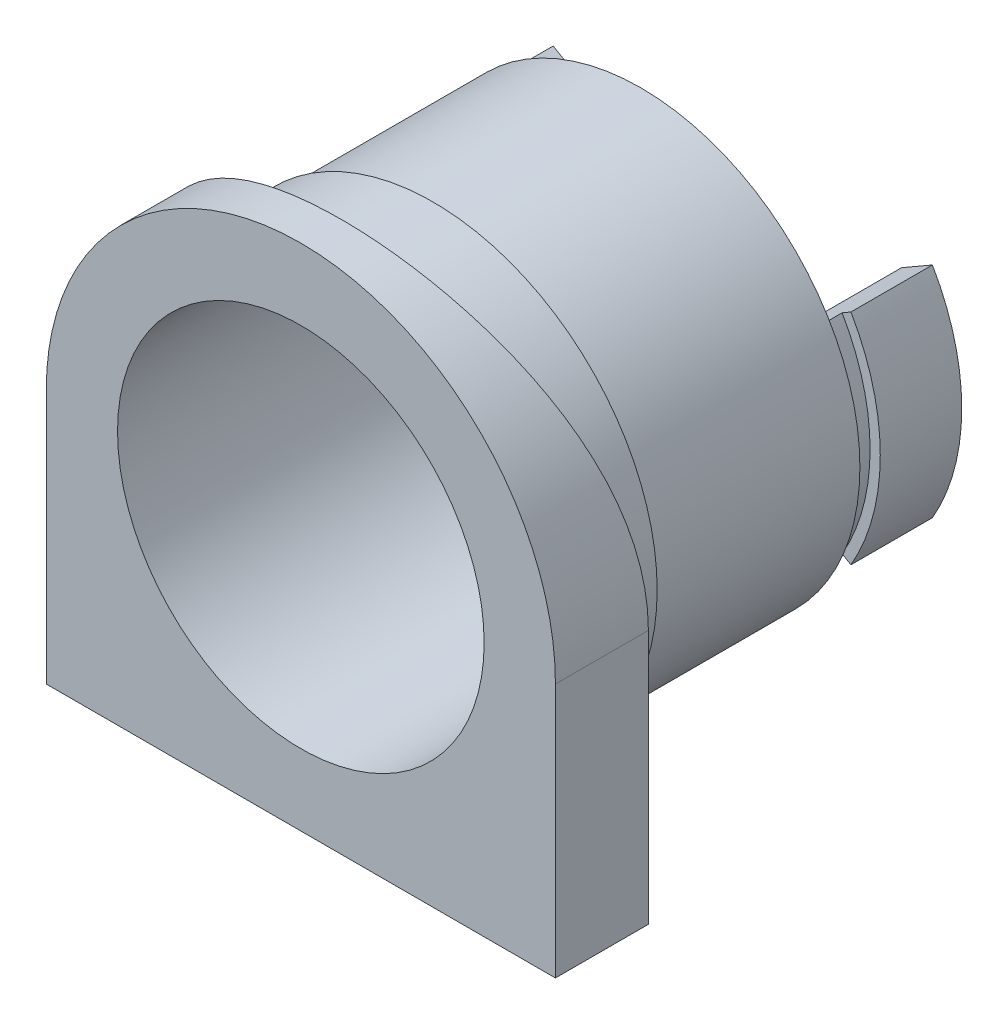
ISO-10303-21;
HEADER;
FILE_DESCRIPTION(('STEP AP214'),'2;1');
FILE_NAME('part.step','',(''),(''),'','','');
FILE_SCHEMA(('AUTOMOTIVE_DESIGN { 1 0 10303 214 1 1 1 1 }'));
ENDSEC;
DATA;
#1=APPLICATION_CONTEXT('core data for automotive mechanical design processes');
#2=APPLICATION_PROTOCOL_DEFINITION('international standard','automotive_design',2000,#1);
#3=PRODUCT_CONTEXT('',#1,'mechanical');
#4=PRODUCT('Part','Part','',(#3));
#5=PRODUCT_RELATED_PRODUCT_CATEGORY('part','',(#4));
#6=PRODUCT_DEFINITION_FORMATION('','',#4);
#7=PRODUCT_DEFINITION_CONTEXT('part definition',#1,'design');
#8=PRODUCT_DEFINITION('design','',#6,#7);
#9=PRODUCT_DEFINITION_SHAPE('','',#8);
#10=(LENGTH_UNIT() NAMED_UNIT(*) SI_UNIT(.MILLI.,.METRE.));
#11=(NAMED_UNIT(*) PLANE_ANGLE_UNIT() SI_UNIT($,.RADIAN.));
#12=(NAMED_UNIT(*) SI_UNIT($,.STERADIAN.) SOLID_ANGLE_UNIT());
#13=UNCERTAINTY_MEASURE_WITH_UNIT(LENGTH_MEASURE(1.E-05),#10,'distance_accuracy_value','');
#14=(GEOMETRIC_REPRESENTATION_CONTEXT(3) GLOBAL_UNCERTAINTY_ASSIGNED_CONTEXT((#13)) GLOBAL_UNIT_ASSIGNED_CONTEXT((#10,
#11,#12)) REPRESENTATION_CONTEXT('',''));
#15=CARTESIAN_POINT('',(0.,0.,0.));
#16=DIRECTION('',(0.,0.,1.));
#17=DIRECTION('',(1.,0.,0.));
#18=AXIS2_PLACEMENT_3D('',#15,#16,#17);
#19=CARTESIAN_POINT('',(0.,25.,0.));
#20=DIRECTION('',(0.,-1.,0.));
#21=DIRECTION('',(0.,0.,-1.));
#22=AXIS2_PLACEMENT_3D('',#19,#20,#21);
#23=CYLINDRICAL_SURFACE('',#22,31.75);
#24=CARTESIAN_POINT('',(11.,12.5,29.7835944774972));
#25=CARTESIAN_POINT('',(11.0000004837366,12.7988045156591,29.7835940735881));
#26=CARTESIAN_POINT('',(10.9878148665602,13.0976019451086,29.7881032642781));
#27=CARTESIAN_POINT('',(10.9391994137707,13.6929411988618,29.8059907783039));
#28=CARTESIAN_POINT('',(10.9027703101694,13.9894830909961,29.8193688338518));
#29=CARTESIAN_POINT('',(10.8060294680746,14.5781508853745,29.8545619247872));
#30=CARTESIAN_POINT('',(10.7457160089366,14.8702764678903,29.8763775680214));
#31=CARTESIAN_POINT('',(10.6017814684766,15.4480269694851,29.9277556625212));
#32=CARTESIAN_POINT('',(10.5181600402937,15.7336517917537,29.9573182290734));
#33=CARTESIAN_POINT('',(10.3285779253418,16.2958230567793,30.0232079131872));
#34=CARTESIAN_POINT('',(10.2226697696831,16.5723891106207,30.0595191007549));
#35=CARTESIAN_POINT('',(9.98922145843859,17.1155020603258,30.137901549864));
#36=CARTESIAN_POINT('',(9.86167326548889,17.3820451884582,30.1799749504355));
#37=CARTESIAN_POINT('',(9.58592887044172,17.9034188829195,30.2686873279618));
#38=CARTESIAN_POINT('',(9.43773299701141,18.1582496355986,30.3153262322398));
#39=CARTESIAN_POINT('',(9.12169709697834,18.654775150094,30.4119127515399));
#40=CARTESIAN_POINT('',(8.95385581382453,18.8964690702086,30.461860578117));
#41=CARTESIAN_POINT('',(8.59277739423418,19.3743933857487,30.5657209928924));
#42=CARTESIAN_POINT('',(8.39881221016691,19.6100569381223,30.619712180324));
#43=CARTESIAN_POINT('',(7.99206848311208,20.0643776369776,30.7283850199948));
#44=CARTESIAN_POINT('',(7.77928955476814,20.2830344349424,30.7830666863572));
#45=CARTESIAN_POINT('',(7.33616201424532,20.7020562394086,30.8916698259496));
#46=CARTESIAN_POINT('',(7.10581008534665,20.9024177771158,30.9455911533869));
#47=CARTESIAN_POINT('',(6.62894704943582,21.283519684909,31.0512349464493));
#48=CARTESIAN_POINT('',(6.38243643121762,21.4642606480709,31.1029574785092));
#49=CARTESIAN_POINT('',(5.86741138620455,21.8098003468942,31.2042755104669));
#50=CARTESIAN_POINT('',(5.59846805973601,21.9739911930013,31.2537670759096));
#51=CARTESIAN_POINT('',(5.0468924444883,22.2789644178502,31.3475611828407));
#52=CARTESIAN_POINT('',(4.76426564402314,22.4197560829766,31.3918657807969));
#53=CARTESIAN_POINT('',(4.1871617275064,22.6768094948052,31.4740387153889));
#54=CARTESIAN_POINT('',(3.89268479427916,22.7930716197775,31.5119071512751));
#55=CARTESIAN_POINT('',(3.29401948129225,22.9999868771507,31.5800993286113));
#56=CARTESIAN_POINT('',(2.98983155442748,23.0906412018949,31.6104234213311));
#57=CARTESIAN_POINT('',(2.38557781894691,23.242551580364,31.661648669663));
#58=CARTESIAN_POINT('',(2.08578234279074,23.3047791272631,31.6828594478546));
#59=CARTESIAN_POINT('',(1.48157824898808,23.4040655773414,31.716856154102));
#60=CARTESIAN_POINT('',(1.17716973616099,23.4411250515264,31.7296422732937));
#61=CARTESIAN_POINT('',(0.566152329793252,23.4896940891277,31.7464227291337));
#62=CARTESIAN_POINT('',(0.259543978805665,23.5012097489534,31.7504191635684));
#63=CARTESIAN_POINT('',(-0.353546032734361,23.4985894231794,31.7495112585533));
#64=CARTESIAN_POINT('',(-0.660027696289746,23.4844540851594,31.7446071438049));
#65=CARTESIAN_POINT('',(-1.25752160589826,23.431822341013,31.7264348376607));
#66=CARTESIAN_POINT('',(-1.54863886729345,23.3943840312893,31.7135300223054));
#67=CARTESIAN_POINT('',(-2.12651247105397,23.2964726286139,31.6800285040974));
#68=CARTESIAN_POINT('',(-2.41326895869279,23.2360003047661,31.659432058068));
#69=CARTESIAN_POINT('',(-2.98048490588686,23.0925584663377,31.6110778125335));
#70=CARTESIAN_POINT('',(-3.26094413271922,23.0095881217923,31.5833197488341));
#71=CARTESIAN_POINT('',(-3.8137342691918,22.8218526711485,31.5213466832944));
#72=CARTESIAN_POINT('',(-4.08606498828875,22.7170870545973,31.4871315302286));
#73=CARTESIAN_POINT('',(-4.6245009768124,22.4850429299172,31.4125986271563));
#74=CARTESIAN_POINT('',(-4.89047352364684,22.357480975659,31.3722050920551));
#75=CARTESIAN_POINT('',(-5.41082449761259,22.0817386355539,31.286659078122));
#76=CARTESIAN_POINT('',(-5.66519860816954,21.9335506551685,31.2415048478858));
#77=CARTESIAN_POINT('',(-6.16074844158412,21.617648130369,31.1475725326789));
#78=CARTESIAN_POINT('',(-6.40192623678451,21.4499366649255,31.0987950195595));
#79=CARTESIAN_POINT('',(-6.86989292902817,21.0959692978268,30.99877994157));
#80=CARTESIAN_POINT('',(-7.09667512541143,20.9097048625371,30.9475412503175));
#81=CARTESIAN_POINT('',(-7.5455872099519,20.5099289214534,30.8412464360083));
#82=CARTESIAN_POINT('',(-7.76689976872512,20.2955152295041,30.7861284038444));
#83=CARTESIAN_POINT('',(-8.19069906421345,19.8489570128521,30.676096087994));
#84=CARTESIAN_POINT('',(-8.39319351321859,19.6168198235177,30.6211817297733));
#85=CARTESIAN_POINT('',(-8.77829891209785,19.1359925404337,30.5130136760306));
#86=CARTESIAN_POINT('',(-8.96089773733547,18.8872925001676,30.4597610071116));
#87=CARTESIAN_POINT('',(-9.30476696647265,18.3750683224439,30.3564826530195));
#88=CARTESIAN_POINT('',(-9.46604582819075,18.111550122976,30.3064556922384));
#89=CARTESIAN_POINT('',(-9.76869617000565,17.5666860069034,30.2102751159569));
#90=CARTESIAN_POINT('',(-9.9096886211705,17.2851152915449,30.1642004873604));
#91=CARTESIAN_POINT('',(-10.1673150822425,16.7101013424783,30.0783419747209));
#92=CARTESIAN_POINT('',(-10.2839486770642,16.4166579065555,30.0385581978794));
#93=CARTESIAN_POINT('',(-10.4917444879667,15.8200936803377,29.9666130251357));
#94=CARTESIAN_POINT('',(-10.5829163086007,15.5169765872955,29.9344487557407));
#95=CARTESIAN_POINT('',(-10.7389279857446,14.9032591907387,29.8788353531875));
#96=CARTESIAN_POINT('',(-10.8037693329844,14.5926593119256,29.8553857266464));
#97=CARTESIAN_POINT('',(-10.903947945824,13.9815880860122,29.8189388863301));
#98=CARTESIAN_POINT('',(-10.9405587434141,13.6813519146249,29.8054916135803));
#99=CARTESIAN_POINT('',(-10.9889306905587,13.0786177345116,29.7876916641315));
#100=CARTESIAN_POINT('',(-11.0006926398669,12.7761197988944,29.7833386947348));
#101=CARTESIAN_POINT('',(-10.9992444023933,12.171248098606,29.783873512462));
#102=CARTESIAN_POINT('',(-10.9860386768088,11.8688743214059,29.7887596487524));
#103=CARTESIAN_POINT('',(-10.9348023974479,11.2665274384167,29.8076053965112));
#104=CARTESIAN_POINT('',(-10.896772197263,10.9665542984952,29.8215648787419));
#105=CARTESIAN_POINT('',(-10.7982107678858,10.3827132232494,29.8573905388713));
#106=CARTESIAN_POINT('',(-10.7385998846091,10.0986692388235,29.8789324348259));
#107=CARTESIAN_POINT('',(-10.5972998528137,9.53668889005206,29.9293394212264));
#108=CARTESIAN_POINT('',(-10.5156029107073,9.25875471920583,29.9582070965259));
#109=CARTESIAN_POINT('',(-10.3308518662873,8.71093069089519,30.0224174687142));
#110=CARTESIAN_POINT('',(-10.2278027450337,8.44103897404423,30.0577586552326));
#111=CARTESIAN_POINT('',(-10.0010967218656,7.91074581268088,30.1339486337277));
#112=CARTESIAN_POINT('',(-9.87743184152771,7.65034809013553,30.1747995568326));
#113=CARTESIAN_POINT('',(-9.60597182563347,7.13216334449882,30.2623330907141));
#114=CARTESIAN_POINT('',(-9.45751233007802,6.87474944756413,30.3091641966178));
#115=CARTESIAN_POINT('',(-9.14053247616061,6.37311332517895,30.406259950664));
#116=CARTESIAN_POINT('',(-8.97200315707815,6.12889706345056,30.4565261281873));
#117=CARTESIAN_POINT('',(-8.6160052865213,5.65512930657603,30.5591436542022));
#118=CARTESIAN_POINT('',(-8.42853564017039,5.42557866045321,30.6114951231313));
#119=CARTESIAN_POINT('',(-8.03578650692215,4.98243394107842,30.716933001531));
#120=CARTESIAN_POINT('',(-7.8305065582212,4.76884028184282,30.7700194300284));
#121=CARTESIAN_POINT('',(-7.39199653835267,4.34797225256389,30.8783830906163));
#122=CARTESIAN_POINT('',(-7.15786228481252,4.14163025934582,30.9336276155229));
#123=CARTESIAN_POINT('',(-6.67268825167441,3.74942845637222,31.0418987789709));
#124=CARTESIAN_POINT('',(-6.42165455539928,3.56356133908655,31.0949262045805));
#125=CARTESIAN_POINT('',(-5.90406191349527,3.2134665229006,31.1973422847447));
#126=CARTESIAN_POINT('',(-5.63749672868136,3.04924760797746,31.2467294586691));
#127=CARTESIAN_POINT('',(-5.09076351663816,2.74386737308592,31.34044520305));
#128=CARTESIAN_POINT('',(-4.81060131491679,2.60269628967937,31.3847759130964));
#129=CARTESIAN_POINT('',(-4.24007560534808,2.3452402135934,31.4669165866103));
#130=CARTESIAN_POINT('',(-3.94977866582297,2.22881914287727,31.5047619715036));
#131=CARTESIAN_POINT('',(-3.3595433494416,2.02090828837879,31.5731566028863));
#132=CARTESIAN_POINT('',(-3.05960495167445,1.92941855867292,31.6037058335503));
#133=CARTESIAN_POINT('',(-2.45242342376734,1.77228237286387,31.6566098731674));
#134=CARTESIAN_POINT('',(-2.14518270393462,1.70662751158658,31.6789673470817));
#135=CARTESIAN_POINT('',(-1.52571084121241,1.60179484681747,31.7148378753717));
#136=CARTESIAN_POINT('',(-1.21347993508479,1.56261579096285,31.7283513480867));
#137=CARTESIAN_POINT('',(-0.602401856905683,1.5124480698062,31.7456813119193));
#138=CARTESIAN_POINT('',(-0.303675580342155,1.50013502939873,31.7499532705671));
#139=CARTESIAN_POINT('',(0.293783051350596,1.49986719472863,31.750045958871));
#140=CARTESIAN_POINT('',(0.592515405878516,1.51191152772046,31.7458669913312));
#141=CARTESIAN_POINT('',(1.18774669222857,1.56023707587323,31.7291727240599));
#142=CARTESIAN_POINT('',(1.48424582395398,1.59651609499283,31.7166581796623));
#143=CARTESIAN_POINT('',(2.07287834248368,1.69295955241364,31.6836325741242));
#144=CARTESIAN_POINT('',(2.36501172166856,1.75312403239645,31.6631214990292));
#145=CARTESIAN_POINT('',(2.93748243189968,1.89544543071902,31.6151021177395));
#146=CARTESIAN_POINT('',(3.21793805328537,1.97717375044415,31.5877306476403));
#147=CARTESIAN_POINT('',(3.77092728442394,2.16243887770285,31.5264972356726));
#148=CARTESIAN_POINT('',(4.04345804012606,2.26598343406927,31.4926329880429));
#149=CARTESIAN_POINT('',(4.57878537623986,2.49403340208929,31.4192650798679));
#150=CARTESIAN_POINT('',(4.84158263790939,2.61853734337758,31.3797618149467));
#151=CARTESIAN_POINT('',(5.35593463997862,2.88760102357413,31.296075964627));
#152=CARTESIAN_POINT('',(5.60748861982956,3.03216211653649,31.2518930633549));
#153=CARTESIAN_POINT('',(6.10742479622201,3.34631997852364,31.1581293445595));
#154=CARTESIAN_POINT('',(6.35530763129633,3.51666903706662,31.1084058118882));
#155=CARTESIAN_POINT('',(6.83596201213684,3.87678657754793,31.0063300017317));
#156=CARTESIAN_POINT('',(7.06873324325283,4.06655546362945,30.9539776695505));
#157=CARTESIAN_POINT('',(7.51789921128115,4.4643779676208,30.8479652905804));
#158=CARTESIAN_POINT('',(7.73428883458543,4.67243725153332,30.7943048423098));
#159=CARTESIAN_POINT('',(8.14935605083224,5.10554497308927,30.6870730306563));
#160=CARTESIAN_POINT('',(8.34803374156719,5.33059331691879,30.6335016667832));
#161=CARTESIAN_POINT('',(8.73473182618425,5.80653214624265,30.5255466770557));
#162=CARTESIAN_POINT('',(8.92191229866699,6.05812100254567,30.4712291407153));
#163=CARTESIAN_POINT('',(9.27432587943315,6.57672973917898,30.3658230246146));
#164=CARTESIAN_POINT('',(9.43956711174731,6.84374385472665,30.3147332533171));
#165=CARTESIAN_POINT('',(9.74695566252108,7.39162220661684,30.217302429698));
#166=CARTESIAN_POINT('',(9.88910078781604,7.67248775496933,30.1709618285031));
#167=CARTESIAN_POINT('',(10.1490944084618,8.24617240574861,30.0845004407149));
#168=CARTESIAN_POINT('',(10.2669437142924,8.53899110904179,30.044379446654));
#169=CARTESIAN_POINT('',(10.475332313564,9.12902285573466,29.9723514621763));
#170=CARTESIAN_POINT('',(10.5663353973888,9.4260551229444,29.9403065698715));
#171=CARTESIAN_POINT('',(10.7230263924875,10.0274978539613,29.8845467486642));
#172=CARTESIAN_POINT('',(10.7887145970947,10.3319082322319,29.8608317232405));
#173=CARTESIAN_POINT('',(10.89407797322,10.9456589118803,29.822553790206));
#174=CARTESIAN_POINT('',(10.9337625073368,11.254997397761,29.8079875886477));
#175=CARTESIAN_POINT('',(10.9867227995942,11.876226556448,29.7885083144017));
#176=CARTESIAN_POINT('',(10.9999994950908,12.188117138272,29.7835948990849));
#177=CARTESIAN_POINT('',(11.,12.5,29.7835944774972));
#178=B_SPLINE_CURVE_WITH_KNOTS('',3,(#24,#25,#26,#27,#28,#29,#30,#31,#32,#33,#34,#35,#36,#37,
#38,#39,#40,#41,#42,#43,#44,#45,#46,#47,#48,#49,#50,#51,#52,#53,#54,#55,#56,#57,#58,#59,#60,#61,
#62,#63,#64,#65,#66,#67,#68,#69,#70,#71,#72,#73,#74,#75,#76,#77,#78,#79,#80,#81,#82,#83,#84,#85,
#86,#87,#88,#89,#90,#91,#92,#93,#94,#95,#96,#97,#98,#99,#100,#101,#102,#103,#104,#105,#106,#107,
#108,#109,#110,#111,#112,#113,#114,#115,#116,#117,#118,#119,#120,#121,#122,#123,#124,#125,#126,
#127,#128,#129,#130,#131,#132,#133,#134,#135,#136,#137,#138,#139,#140,#141,#142,#143,#144,#145,
#146,#147,#148,#149,#150,#151,#152,#153,#154,#155,#156,#157,#158,#159,#160,#161,#162,#163,#164,
#165,#166,#167,#168,#169,#170,#171,#172,#173,#174,#175,#176,#177),.UNSPECIFIED.,.T.,.F.,(4,2,2,
2,2,2,2,2,2,2,2,2,2,2,2,2,2,2,2,2,2,2,2,2,2,2,2,2,2,2,2,2,2,2,2,2,2,2,2,2,2,2,2,2,2,2,2,2,2,2,2,
2,2,2,2,2,2,2,2,2,2,2,2,2,2,2,2,2,2,2,2,2,2,2,2,2,4),(0.,0.89612050760437,1.7922139588274,
2.68837197695511,3.58454333209999,4.47862555660303,5.37304058361594,6.26744137507036,
7.1618994050876,8.09072887239581,9.0195773690543,9.94860161194232,10.8775977651719,
11.8333080893072,12.7886382122211,13.7439536019085,14.6992245031288,15.6188188828204,
16.5383923983323,17.4577464203895,18.3770772329545,19.2574365057819,20.1377663860588,
21.0181287466202,21.8985117278893,22.790717986032,23.6832536293965,24.5756487047405,
25.4684561588987,26.4064810083158,27.3441197126063,28.2823266666072,29.2201603014377,
30.173714931476,31.1272858091693,32.0804964986421,33.0336532134733,33.940782606189,
34.8478828027373,35.7548209349166,36.6617461492552,37.5338372804966,38.4062365522932,
39.2784325384935,40.1509668567785,41.0524443208023,41.9543257937677,42.8562594313253,
43.7582164621281,44.7078983658289,45.6572402201688,46.6069661016209,47.5562886138642,
48.5002483441756,49.4442101219345,50.3878645346253,51.3314743072981,52.2274054328297,
53.1233044569512,54.019122309629,54.9149417255712,55.7941460530752,56.6736631901268,
57.5531186520391,58.4326335147197,59.3461803028218,60.2597461064806,61.1735959187592,
62.0874406851106,63.0410501622234,63.9943055300396,64.9476513644316,65.9009653911888,
66.8366892440448,67.7724022539836,68.7077781758885,69.6431208956873),.UNSPECIFIED.);
#179=CARTESIAN_POINT('',(11.,12.5,29.7835944774972));
#180=VERTEX_POINT('',#179);
#181=EDGE_CURVE('E284',#180,#180,#178,.T.);
#182=ORIENTED_EDGE('',*,*,#181,.T.);
#183=EDGE_LOOP('',(#182));
#184=FACE_BOUND('',#183,.T.);
#185=CARTESIAN_POINT('',(12.5,12.5,29.1858270398493));
#186=CARTESIAN_POINT('',(12.500000681174,12.6683947598953,29.185824502863));
#187=CARTESIAN_POINT('',(12.4965965258948,12.8367672094388,29.1872849933505));
#188=CARTESIAN_POINT('',(12.4829952330995,13.1731810831606,29.193105511989));
#189=CARTESIAN_POINT('',(12.4727983500225,13.3412225195015,29.1974654315343));
#190=CARTESIAN_POINT('',(12.4320593241305,13.8442413166206,29.2148478721032));
#191=CARTESIAN_POINT('',(12.3913687615542,14.1783129470855,29.2321731366469));
#192=CARTESIAN_POINT('',(12.2835746670639,14.8400409497707,29.27763088871));
#193=CARTESIAN_POINT('',(12.2165728803687,15.1677169900418,29.3057217358835));
#194=CARTESIAN_POINT('',(12.0568345026548,15.815734690863,29.3718011680507));
#195=CARTESIAN_POINT('',(11.9640964094384,16.1360759221071,29.4097903307896));
#196=CARTESIAN_POINT('',(11.753897655103,16.7668828716148,29.4944264759805));
#197=CARTESIAN_POINT('',(11.636468705882,17.0773606748711,29.5410623439725));
#198=CARTESIAN_POINT('',(11.3777663448393,17.6871149920698,29.6416630498035));
#199=CARTESIAN_POINT('',(11.2364838499793,17.9863871858636,29.6956306779213));
#200=CARTESIAN_POINT('',(10.9311108928296,18.5720618166748,29.8093921631098));
#201=CARTESIAN_POINT('',(10.7670104368175,18.8584585414151,29.8691885695968));
#202=CARTESIAN_POINT('',(10.4170818489378,19.4168657129839,29.9930218308649));
#203=CARTESIAN_POINT('',(10.2312436803657,19.6888694294435,30.0570606384766));
#204=CARTESIAN_POINT('',(9.82927634147381,20.2301051693252,30.1909736914685));
#205=CARTESIAN_POINT('',(9.61210094260061,20.4985280631909,30.2609797853123));
#206=CARTESIAN_POINT('',(9.15654039077104,21.0162562985031,30.4019257049153));
#207=CARTESIAN_POINT('',(8.91816370250819,21.2655691963233,30.4728651484778));
#208=CARTESIAN_POINT('',(8.42133978787304,21.7439177131666,30.6138897065208));
#209=CARTESIAN_POINT('',(8.16288065312289,21.9729411261228,30.6839742851506));
#210=CARTESIAN_POINT('',(7.62756254155442,22.409058351005,30.8214068105949));
#211=CARTESIAN_POINT('',(7.35071045757977,22.6161603034863,30.8887557675188));
#212=CARTESIAN_POINT('',(6.76910993131326,23.0146624476908,31.0215082959345));
#213=CARTESIAN_POINT('',(6.46369862924298,23.2051549043164,31.0867379889302));
#214=CARTESIAN_POINT('',(5.83653477964978,23.5595931550246,31.2105673948998));
#215=CARTESIAN_POINT('',(5.51478169488399,23.7235380756027,31.2691668896985));
#216=CARTESIAN_POINT('',(4.85721182554007,24.023368317228,31.3780337713502));
#217=CARTESIAN_POINT('',(4.52139956757596,24.1592625873991,31.4283038145726));
#218=CARTESIAN_POINT('',(3.83806264508903,24.401709198964,31.5190503118722));
#219=CARTESIAN_POINT('',(3.49053870523041,24.5082633520595,31.5595273706308));
#220=CARTESIAN_POINT('',(2.80306066538316,24.6865893876332,31.6278201190493));
#221=CARTESIAN_POINT('',(2.46351994946712,24.7597621236818,31.6561420031095));
#222=CARTESIAN_POINT('',(1.77881204952188,24.8776610210229,31.7019878557479));
#223=CARTESIAN_POINT('',(1.43364502691406,24.9223879969694,31.7195121335568));
#224=CARTESIAN_POINT('',(0.740495480617894,24.9828948375113,31.743257370208));
#225=CARTESIAN_POINT('',(0.392513800178303,24.9986830711867,31.7494815970186));
#226=CARTESIAN_POINT('',(-0.303563621320748,25.0011586856411,31.7504561026889));
#227=CARTESIAN_POINT('',(-0.651659358119436,24.9878470516973,31.745206770026));
#228=CARTESIAN_POINT('',(-1.32624209333998,24.9337954189748,31.7239846499863));
#229=CARTESIAN_POINT('',(-1.65287240360701,24.8945905701779,31.7086121820229));
#230=CARTESIAN_POINT('',(-2.30142776243951,24.7906987778796,31.6681462566775));
#231=CARTESIAN_POINT('',(-2.62335301377195,24.726012935873,31.643053219498));
#232=CARTESIAN_POINT('',(-3.26033049990505,24.5717702617362,31.5837786507549));
#233=CARTESIAN_POINT('',(-3.57538259826194,24.4822129363484,31.549596938943));
#234=CARTESIAN_POINT('',(-4.19659231747662,24.2790245295243,31.4729895353529));
#235=CARTESIAN_POINT('',(-4.50274969215006,24.165392782487,31.4305636156443));
#236=CARTESIAN_POINT('',(-5.108754740744,23.9131471562472,31.3378122026961));
#237=CARTESIAN_POINT('',(-5.40844284581223,23.7741896643326,31.2873794676709));
#238=CARTESIAN_POINT('',(-5.99511877122897,23.4734794824877,31.1802824260667));
#239=CARTESIAN_POINT('',(-6.28210197362068,23.3117185919695,31.1236158792934));
#240=CARTESIAN_POINT('',(-6.84172153637751,22.9665627409067,31.0054051701929));
#241=CARTESIAN_POINT('',(-7.11435654821618,22.7831657521081,30.9438605507536));
#242=CARTESIAN_POINT('',(-7.64385017515167,22.3959158501754,30.8173354732486));
#243=CARTESIAN_POINT('',(-7.90070798517794,22.1920618945698,30.7523548401662));
#244=CARTESIAN_POINT('',(-8.41320005225029,21.7514552100128,30.61625825404));
#245=CARTESIAN_POINT('',(-8.66771064409511,21.5134332987741,30.5450153723116));
#246=CARTESIAN_POINT('',(-9.15595193592759,21.0170273978028,30.4022327381339));
#247=CARTESIAN_POINT('',(-9.38968186092641,20.758642649341,30.3306929747167));
#248=CARTESIAN_POINT('',(-9.83505210026969,20.222896830153,30.1892178326921));
#249=CARTESIAN_POINT('',(-10.0466839452729,19.9455285507035,30.1192830771758));
#250=CARTESIAN_POINT('',(-10.4464159243595,19.3734399084734,29.9829869110573));
#251=CARTESIAN_POINT('',(-10.6345133847999,19.0787175797552,29.9166259069411));
#252=CARTESIAN_POINT('',(-10.990629045473,18.4653370300038,29.7876724482339));
#253=CARTESIAN_POINT('',(-11.1579554568322,18.1462441285567,29.7252331708354));
#254=CARTESIAN_POINT('',(-11.4648363223169,17.493741404517,29.6082252832817));
#255=CARTESIAN_POINT('',(-11.6044025971037,17.1603377494925,29.5536533258457));
#256=CARTESIAN_POINT('',(-11.8543566877896,16.4818039453556,29.4542835367313));
#257=CARTESIAN_POINT('',(-11.9647802000077,16.136688732054,29.4094737594346));
#258=CARTESIAN_POINT('',(-12.1554371715181,15.437131615192,29.3311860426723));
#259=CARTESIAN_POINT('',(-12.2356841886682,15.0826939768288,29.2977030149445));
#260=CARTESIAN_POINT('',(-12.3666523666983,14.3586017015129,29.2426680256794));
#261=CARTESIAN_POINT('',(-12.4166222568309,13.9887858244769,29.2214202471009));
#262=CARTESIAN_POINT('',(-12.4666242090409,13.4317007934436,29.2001037833129));
#263=CARTESIAN_POINT('',(-12.4791326998786,13.2456642081305,29.1947575167451));
#264=CARTESIAN_POINT('',(-12.4958222923358,12.8730954335746,29.187616733677));
#265=CARTESIAN_POINT('',(-12.5000009553148,12.6865631152002,29.1858232572926));
#266=CARTESIAN_POINT('',(-12.5,12.5,29.1858270398493));
#267=B_SPLINE_CURVE_WITH_KNOTS('',3,(#185,#186,#187,#188,#189,#190,#191,#192,#193,#194,#195,
#196,#197,#198,#199,#200,#201,#202,#203,#204,#205,#206,#207,#208,#209,#210,#211,#212,#213,#214,
#215,#216,#217,#218,#219,#220,#221,#222,#223,#224,#225,#226,#227,#228,#229,#230,#231,#232,#233,
#234,#235,#236,#237,#238,#239,#240,#241,#242,#243,#244,#245,#246,#247,#248,#249,#250,#251,#252,
#253,#254,#255,#256,#257,#258,#259,#260,#261,#262,#263,#264,#265,#266),.UNSPECIFIED.,.F.,.F.,(4,
2,2,2,2,2,2,2,2,2,2,2,2,2,2,2,2,2,2,2,2,2,2,2,2,2,2,2,2,2,2,2,2,2,2,2,2,2,2,2,4),(0.,
0.505099275793884,1.01017963285954,2.01974308857927,3.02544042018686,4.03119646550707,
5.03566856540298,6.04052401798826,7.04582096769675,8.05158392755791,9.107316526637,
10.1626294966353,11.2185730872474,12.274123166236,13.370186436108,14.4662857628672,
15.5620348538358,16.6577162690016,17.7018358291127,18.7459254854858,19.7897131436059,
20.8334654612063,21.8203056214623,22.8071031271754,23.7939202047028,24.7807645689597,
25.7821579653133,26.7839124071398,27.7857608321523,28.7876603365509,29.8534833342511,
30.9193460638214,31.9856158095092,33.0520065798594,34.1476305320331,35.2427869484489,
36.3365956401854,37.4299123108523,38.5493515446696,39.1087607245319,39.6683336529952),.UNSPECIFIED.);
#268=CARTESIAN_POINT('',(12.5,12.5,29.1858270398493));
#269=VERTEX_POINT('',#268);
#270=CARTESIAN_POINT('',(-12.5,12.5,29.1858270398493));
#271=VERTEX_POINT('',#270);
#272=EDGE_CURVE('E157',#269,#271,#267,.T.);
#273=ORIENTED_EDGE('',*,*,#272,.F.);
#274=DIRECTION('',(0.,-1.,0.));
#275=VECTOR('',#274,1.);
#276=CARTESIAN_POINT('',(12.5,25.,29.1858270398493));
#277=LINE('',#276,#275);
#278=CARTESIAN_POINT('',(12.5,0.,29.1858270398493));
#279=VERTEX_POINT('',#278);
#280=EDGE_CURVE('E170',#269,#279,#277,.T.);
#281=ORIENTED_EDGE('',*,*,#280,.T.);
#282=CARTESIAN_POINT('',(0.,0.,0.));
#283=DIRECTION('',(0.,-1.,0.));
#284=DIRECTION('',(0.,0.,1.));
#285=AXIS2_PLACEMENT_3D('',#282,#283,#284);
#286=CIRCLE('',#285,31.75);
#287=CARTESIAN_POINT('',(-12.5,0.,29.1858270398493));
#288=VERTEX_POINT('',#287);
#289=EDGE_CURVE('E290',#279,#288,#286,.T.);
#290=ORIENTED_EDGE('',*,*,#289,.T.);
#291=DIRECTION('',(0.,-1.,0.));
#292=VECTOR('',#291,1.);
#293=CARTESIAN_POINT('',(-12.5,25.,29.1858270398493));
#294=LINE('',#293,#292);
#295=EDGE_CURVE('E166',#271,#288,#294,.T.);
#296=ORIENTED_EDGE('',*,*,#295,.F.);
#297=EDGE_LOOP('',(#273,#281,#290,#296));
#298=FACE_BOUND('',#297,.T.);
#299=ADVANCED_FACE('F32',(#184,#298),#23,.F.);
#300=CARTESIAN_POINT('',(-12.5,25.,29.1858270398493));
#301=DIRECTION('',(1.,0.,0.));
#302=DIRECTION('',(0.,0.,-1.));
#303=AXIS2_PLACEMENT_3D('',#300,#301,#302);
#304=PLANE('',#303);
#305=DIRECTION('',(0.,0.,1.));
#306=VECTOR('',#305,1.);
#307=CARTESIAN_POINT('',(-12.5,12.5,23.75));
#308=LINE('',#307,#306);
#309=CARTESIAN_POINT('',(-12.5,12.5,33.75));
#310=VERTEX_POINT('',#309);
#311=EDGE_CURVE('E152',#271,#310,#308,.T.);
#312=ORIENTED_EDGE('',*,*,#311,.F.);
#313=ORIENTED_EDGE('',*,*,#295,.T.);
#314=DIRECTION('',(0.,0.,1.));
#315=VECTOR('',#314,1.);
#316=CARTESIAN_POINT('',(-12.5,0.,29.1858270398493));
#317=LINE('',#316,#315);
#318=CARTESIAN_POINT('',(-12.5,0.,33.75));
#319=VERTEX_POINT('',#318);
#320=EDGE_CURVE('E164',#288,#319,#317,.T.);
#321=ORIENTED_EDGE('',*,*,#320,.T.);
#322=DIRECTION('',(0.,-1.,0.));
#323=VECTOR('',#322,1.);
#324=CARTESIAN_POINT('',(-12.5,25.,33.75));
#325=LINE('',#324,#323);
#326=EDGE_CURVE('E149',#310,#319,#325,.T.);
#327=ORIENTED_EDGE('',*,*,#326,.F.);
#328=EDGE_LOOP('',(#312,#313,#321,#327));
#329=FACE_BOUND('',#328,.T.);
#330=ADVANCED_FACE('F162',(#329),#304,.F.);
#331=CARTESIAN_POINT('',(-12.5,25.,33.75));
#332=DIRECTION('',(0.,0.,-1.));
#333=DIRECTION('',(-1.,0.,0.));
#334=AXIS2_PLACEMENT_3D('',#331,#332,#333);
#335=PLANE('',#334);
#336=CARTESIAN_POINT('',(0.,12.5,33.75));
#337=DIRECTION('',(0.,0.,1.));
#338=DIRECTION('',(1.,0.,0.));
#339=AXIS2_PLACEMENT_3D('',#336,#337,#338);
#340=CIRCLE('',#339,9.);
#341=CARTESIAN_POINT('',(9.,12.5,33.75));
#342=VERTEX_POINT('',#341);
#343=EDGE_CURVE('E286',#342,#342,#340,.T.);
#344=ORIENTED_EDGE('',*,*,#343,.F.);
#345=EDGE_LOOP('',(#344));
#346=FACE_BOUND('',#345,.T.);
#347=CARTESIAN_POINT('',(0.,12.5,33.75));
#348=DIRECTION('',(0.,0.,1.));
#349=DIRECTION('',(-1.,0.,0.));
#350=AXIS2_PLACEMENT_3D('',#347,#348,#349);
#351=CIRCLE('',#350,12.5);
#352=CARTESIAN_POINT('',(12.5,12.5,33.75));
#353=VERTEX_POINT('',#352);
#354=EDGE_CURVE('E49',#353,#310,#351,.T.);
#355=ORIENTED_EDGE('',*,*,#354,.T.);
#356=ORIENTED_EDGE('',*,*,#326,.T.);
#357=DIRECTION('',(1.,0.,0.));
#358=VECTOR('',#357,1.);
#359=CARTESIAN_POINT('',(-12.5,0.,33.75));
#360=LINE('',#359,#358);
#361=CARTESIAN_POINT('',(12.5,0.,33.75));
#362=VERTEX_POINT('',#361);
#363=EDGE_CURVE('E335',#319,#362,#360,.T.);
#364=ORIENTED_EDGE('',*,*,#363,.T.);
#365=DIRECTION('',(0.,-1.,0.));
#366=VECTOR('',#365,1.);
#367=CARTESIAN_POINT('',(12.5,25.,33.75));
#368=LINE('',#367,#366);
#369=EDGE_CURVE('E151',#353,#362,#368,.T.);
#370=ORIENTED_EDGE('',*,*,#369,.F.);
#371=EDGE_LOOP('',(#355,#356,#364,#370));
#372=FACE_BOUND('',#371,.T.);
#373=ADVANCED_FACE('F146',(#346,#372),#335,.F.);
#374=CARTESIAN_POINT('',(-7.79422863406001,8.00000000000011,12.05));
#375=DIRECTION('',(-0.499999999999988,0.866025403784446,0.));
#376=DIRECTION('',(-0.866025403784446,-0.499999999999988,0.));
#377=AXIS2_PLACEMENT_3D('',#374,#375,#376);
#378=PLANE('',#377);
#379=DIRECTION('',(0.866025403784446,0.499999999999988,0.));
#380=VECTOR('',#379,1.);
#381=CARTESIAN_POINT('',(-7.79422863406001,8.00000000000011,16.05));
#382=LINE('',#381,#380);
#383=CARTESIAN_POINT('',(-9.30977309068279,7.12500000000013,16.05));
#384=VERTEX_POINT('',#383);
#385=CARTESIAN_POINT('',(-8.87676038879057,7.37500000000012,16.05));
#386=VERTEX_POINT('',#385);
#387=EDGE_CURVE('E380',#384,#386,#382,.T.);
#388=ORIENTED_EDGE('',*,*,#387,.F.);
#389=DIRECTION('',(0.,0.,-1.));
#390=VECTOR('',#389,1.);
#391=CARTESIAN_POINT('',(-9.30977309068279,7.12500000000013,27.255));
#392=LINE('',#391,#390);
#393=CARTESIAN_POINT('',(-9.30977309068279,7.12500000000013,12.05));
#394=VERTEX_POINT('',#393);
#395=EDGE_CURVE('E198',#394,#384,#392,.F.);
#396=ORIENTED_EDGE('',*,*,#395,.F.);
#397=DIRECTION('',(-0.866025403784446,-0.499999999999988,0.));
#398=VECTOR('',#397,1.);
#399=CARTESIAN_POINT('',(-7.79422863406001,8.00000000000011,12.05));
#400=LINE('',#399,#398);
#401=CARTESIAN_POINT('',(-7.79422863406001,8.00000000000011,12.05));
#402=VERTEX_POINT('',#401);
#403=EDGE_CURVE('E238',#402,#394,#400,.T.);
#404=ORIENTED_EDGE('',*,*,#403,.F.);
#405=DIRECTION('',(0.,0.,1.));
#406=VECTOR('',#405,1.);
#407=CARTESIAN_POINT('',(-7.79422863406001,8.00000000000011,12.05));
#408=LINE('',#407,#406);
#409=CARTESIAN_POINT('',(-7.79422863406001,8.00000000000011,17.05));
#410=VERTEX_POINT('',#409);
#411=EDGE_CURVE('E184',#402,#410,#408,.T.);
#412=ORIENTED_EDGE('',*,*,#411,.T.);
#413=DIRECTION('',(-0.866025403784446,-0.499999999999988,0.));
#414=VECTOR('',#413,1.);
#415=CARTESIAN_POINT('',(-7.79422863406001,8.00000000000011,17.05));
#416=LINE('',#415,#414);
#417=CARTESIAN_POINT('',(-8.87676038879057,7.37500000000012,17.05));
#418=VERTEX_POINT('',#417);
#419=EDGE_CURVE('E234',#410,#418,#416,.T.);
#420=ORIENTED_EDGE('',*,*,#419,.T.);
#421=DIRECTION('',(0.,0.,-1.));
#422=VECTOR('',#421,1.);
#423=CARTESIAN_POINT('',(-8.87676038879057,7.37500000000012,12.049975));
#424=LINE('',#423,#422);
#425=EDGE_CURVE('E381',#386,#418,#424,.F.);
#426=ORIENTED_EDGE('',*,*,#425,.F.);
#427=EDGE_LOOP('',(#388,#396,#404,#412,#420,#426));
#428=FACE_BOUND('',#427,.T.);
#429=ADVANCED_FACE('F317',(#428),#378,.F.);
#430=CARTESIAN_POINT('',(-7.79422863405994,17.,12.05));
#431=DIRECTION('',(-0.500000000000002,-0.866025403784437,0.));
#432=DIRECTION('',(0.866025403784437,-0.500000000000002,0.));
#433=AXIS2_PLACEMENT_3D('',#430,#431,#432);
#434=PLANE('',#433);
#435=DIRECTION('',(-0.866025403784437,0.500000000000002,0.));
#436=VECTOR('',#435,1.);
#437=CARTESIAN_POINT('',(-7.79422863405994,17.,16.05));
#438=LINE('',#437,#436);
#439=CARTESIAN_POINT('',(-8.87676038879049,17.625,16.05));
#440=VERTEX_POINT('',#439);
#441=CARTESIAN_POINT('',(-9.30977309068271,17.875,16.05));
#442=VERTEX_POINT('',#441);
#443=EDGE_CURVE('E206',#440,#442,#438,.T.);
#444=ORIENTED_EDGE('',*,*,#443,.F.);
#445=DIRECTION('',(0.,0.,-1.));
#446=VECTOR('',#445,1.);
#447=CARTESIAN_POINT('',(-8.87676038879049,17.625,12.049975));
#448=LINE('',#447,#446);
#449=CARTESIAN_POINT('',(-8.87676038879049,17.625,17.05));
#450=VERTEX_POINT('',#449);
#451=EDGE_CURVE('E260',#450,#440,#448,.T.);
#452=ORIENTED_EDGE('',*,*,#451,.F.);
#453=DIRECTION('',(0.866025403784437,-0.500000000000002,0.));
#454=VECTOR('',#453,1.);
#455=CARTESIAN_POINT('',(-7.79422863405994,17.,17.05));
#456=LINE('',#455,#454);
#457=CARTESIAN_POINT('',(-7.79422863405994,17.,17.05));
#458=VERTEX_POINT('',#457);
#459=EDGE_CURVE('E36',#450,#458,#456,.T.);
#460=ORIENTED_EDGE('',*,*,#459,.T.);
#461=DIRECTION('',(0.,0.,1.));
#462=VECTOR('',#461,1.);
#463=CARTESIAN_POINT('',(-7.79422863405994,17.,12.05));
#464=LINE('',#463,#462);
#465=CARTESIAN_POINT('',(-7.79422863405994,17.,12.05));
#466=VERTEX_POINT('',#465);
#467=EDGE_CURVE('E242',#466,#458,#464,.T.);
#468=ORIENTED_EDGE('',*,*,#467,.F.);
#469=DIRECTION('',(0.866025403784437,-0.500000000000002,0.));
#470=VECTOR('',#469,1.);
#471=CARTESIAN_POINT('',(-7.79422863405994,17.,12.05));
#472=LINE('',#471,#470);
#473=CARTESIAN_POINT('',(-9.30977309068271,17.875,12.05));
#474=VERTEX_POINT('',#473);
#475=EDGE_CURVE('E208',#474,#466,#472,.T.);
#476=ORIENTED_EDGE('',*,*,#475,.F.);
#477=DIRECTION('',(0.,0.,-1.));
#478=VECTOR('',#477,1.);
#479=CARTESIAN_POINT('',(-9.30977309068271,17.875,27.255));
#480=LINE('',#479,#478);
#481=EDGE_CURVE('E195',#442,#474,#480,.T.);
#482=ORIENTED_EDGE('',*,*,#481,.F.);
#483=EDGE_LOOP('',(#444,#452,#460,#468,#476,#482));
#484=FACE_BOUND('',#483,.T.);
#485=ADVANCED_FACE('F204',(#484),#434,.F.);
#486=CARTESIAN_POINT('',(7.79422863406001,16.9999999999999,12.05));
#487=DIRECTION('',(0.499999999999988,-0.866025403784446,0.));
#488=DIRECTION('',(0.866025403784446,0.499999999999988,0.));
#489=AXIS2_PLACEMENT_3D('',#486,#487,#488);
#490=PLANE('',#489);
#491=DIRECTION('',(-0.866025403784446,-0.499999999999988,0.));
#492=VECTOR('',#491,1.);
#493=CARTESIAN_POINT('',(7.79422863406001,16.9999999999999,16.05));
#494=LINE('',#493,#492);
#495=CARTESIAN_POINT('',(9.30977309068279,17.8749999999999,16.05));
#496=VERTEX_POINT('',#495);
#497=CARTESIAN_POINT('',(8.87676038879057,17.6249999999999,16.05));
#498=VERTEX_POINT('',#497);
#499=EDGE_CURVE('E386',#496,#498,#494,.T.);
#500=ORIENTED_EDGE('',*,*,#499,.F.);
#501=DIRECTION('',(0.,0.,-1.));
#502=VECTOR('',#501,1.);
#503=CARTESIAN_POINT('',(9.30977309068279,17.8749999999999,27.255));
#504=LINE('',#503,#502);
#505=CARTESIAN_POINT('',(9.30977309068279,17.8749999999999,12.05));
#506=VERTEX_POINT('',#505);
#507=EDGE_CURVE('E216',#506,#496,#504,.F.);
#508=ORIENTED_EDGE('',*,*,#507,.F.);
#509=DIRECTION('',(0.866025403784446,0.499999999999988,0.));
#510=VECTOR('',#509,1.);
#511=CARTESIAN_POINT('',(7.79422863406001,16.9999999999999,12.05));
#512=LINE('',#511,#510);
#513=CARTESIAN_POINT('',(7.79422863406001,16.9999999999999,12.05));
#514=VERTEX_POINT('',#513);
#515=EDGE_CURVE('E223',#514,#506,#512,.T.);
#516=ORIENTED_EDGE('',*,*,#515,.F.);
#517=DIRECTION('',(0.,0.,1.));
#518=VECTOR('',#517,1.);
#519=CARTESIAN_POINT('',(7.79422863406001,16.9999999999999,12.05));
#520=LINE('',#519,#518);
#521=CARTESIAN_POINT('',(7.79422863406001,16.9999999999999,17.05));
#522=VERTEX_POINT('',#521);
#523=EDGE_CURVE('E232',#514,#522,#520,.T.);
#524=ORIENTED_EDGE('',*,*,#523,.T.);
#525=DIRECTION('',(0.866025403784446,0.499999999999988,0.));
#526=VECTOR('',#525,1.);
#527=CARTESIAN_POINT('',(7.79422863406001,16.9999999999999,17.05));
#528=LINE('',#527,#526);
#529=CARTESIAN_POINT('',(8.87676038879057,17.6249999999999,17.05));
#530=VERTEX_POINT('',#529);
#531=EDGE_CURVE('E209',#522,#530,#528,.T.);
#532=ORIENTED_EDGE('',*,*,#531,.T.);
#533=DIRECTION('',(0.,0.,-1.));
#534=VECTOR('',#533,1.);
#535=CARTESIAN_POINT('',(8.87676038879057,17.6249999999999,12.049975));
#536=LINE('',#535,#534);
#537=EDGE_CURVE('E272',#498,#530,#536,.F.);
#538=ORIENTED_EDGE('',*,*,#537,.F.);
#539=EDGE_LOOP('',(#500,#508,#516,#524,#532,#538));
#540=FACE_BOUND('',#539,.T.);
#541=ADVANCED_FACE('F271',(#540),#490,.F.);
#542=CARTESIAN_POINT('',(7.79422863405997,7.99999999999988,12.05));
#543=DIRECTION('',(0.499999999999997,0.866025403784441,0.));
#544=DIRECTION('',(-0.866025403784441,0.499999999999997,0.));
#545=AXIS2_PLACEMENT_3D('',#542,#543,#544);
#546=PLANE('',#545);
#547=DIRECTION('',(0.866025403784441,-0.499999999999997,0.));
#548=VECTOR('',#547,1.);
#549=CARTESIAN_POINT('',(7.79422863405997,7.99999999999988,16.05));
#550=LINE('',#549,#548);
#551=CARTESIAN_POINT('',(8.87676038879045,7.37499999999992,16.05));
#552=VERTEX_POINT('',#551);
#553=CARTESIAN_POINT('',(9.30977309068267,7.12499999999992,16.05));
#554=VERTEX_POINT('',#553);
#555=EDGE_CURVE('E404',#552,#554,#550,.T.);
#556=ORIENTED_EDGE('',*,*,#555,.F.);
#557=DIRECTION('',(0.,0.,-1.));
#558=VECTOR('',#557,1.);
#559=CARTESIAN_POINT('',(8.87676038879045,7.37499999999992,12.049975));
#560=LINE('',#559,#558);
#561=CARTESIAN_POINT('',(8.87676038879045,7.37499999999992,17.05));
#562=VERTEX_POINT('',#561);
#563=EDGE_CURVE('E12',#562,#552,#560,.T.);
#564=ORIENTED_EDGE('',*,*,#563,.F.);
#565=DIRECTION('',(-0.86602540378444,0.499999999999997,0.));
#566=VECTOR('',#565,1.);
#567=CARTESIAN_POINT('',(7.79422863405997,7.99999999999988,17.05));
#568=LINE('',#567,#566);
#569=CARTESIAN_POINT('',(7.79422863405997,7.99999999999988,17.05));
#570=VERTEX_POINT('',#569);
#571=EDGE_CURVE('E213',#562,#570,#568,.T.);
#572=ORIENTED_EDGE('',*,*,#571,.T.);
#573=DIRECTION('',(0.,0.,1.));
#574=VECTOR('',#573,1.);
#575=CARTESIAN_POINT('',(7.79422863405997,7.99999999999988,12.05));
#576=LINE('',#575,#574);
#577=CARTESIAN_POINT('',(7.79422863405997,7.99999999999988,12.05));
#578=VERTEX_POINT('',#577);
#579=EDGE_CURVE('E227',#578,#570,#576,.T.);
#580=ORIENTED_EDGE('',*,*,#579,.F.);
#581=DIRECTION('',(-0.86602540378444,0.499999999999997,0.));
#582=VECTOR('',#581,1.);
#583=CARTESIAN_POINT('',(7.79422863405997,7.99999999999988,12.05));
#584=LINE('',#583,#582);
#585=CARTESIAN_POINT('',(9.30977309068267,7.12499999999992,12.05));
#586=VERTEX_POINT('',#585);
#587=EDGE_CURVE('E226',#586,#578,#584,.T.);
#588=ORIENTED_EDGE('',*,*,#587,.F.);
#589=DIRECTION('',(0.,0.,-1.));
#590=VECTOR('',#589,1.);
#591=CARTESIAN_POINT('',(9.30977309068267,7.12499999999992,27.255));
#592=LINE('',#591,#590);
#593=EDGE_CURVE('E57',#554,#586,#592,.T.);
#594=ORIENTED_EDGE('',*,*,#593,.F.);
#595=EDGE_LOOP('',(#556,#564,#572,#580,#588,#594));
#596=FACE_BOUND('',#595,.T.);
#597=ADVANCED_FACE('F282',(#596),#546,.F.);
#598=CARTESIAN_POINT('',(0.,12.5,27.255));
#599=DIRECTION('',(0.,0.,-1.));
#600=DIRECTION('',(-1.,0.,0.));
#601=AXIS2_PLACEMENT_3D('',#598,#599,#600);
#602=CYLINDRICAL_SURFACE('',#601,10.75);
#603=ORIENTED_EDGE('',*,*,#395,.T.);
#604=CARTESIAN_POINT('',(0.,12.5,16.05));
#605=DIRECTION('',(0.,0.,1.));
#606=DIRECTION('',(1.,0.,0.));
#607=AXIS2_PLACEMENT_3D('',#604,#605,#606);
#608=CIRCLE('',#607,10.75);
#609=EDGE_CURVE('E42',#384,#442,#608,.F.);
#610=ORIENTED_EDGE('',*,*,#609,.T.);
#611=ORIENTED_EDGE('',*,*,#481,.T.);
#612=CARTESIAN_POINT('',(0.,12.5,12.05));
#613=DIRECTION('',(0.,0.,-1.));
#614=DIRECTION('',(-1.,0.,0.));
#615=AXIS2_PLACEMENT_3D('',#612,#613,#614);
#616=CIRCLE('',#615,10.75);
#617=EDGE_CURVE('E392',#394,#474,#616,.T.);
#618=ORIENTED_EDGE('',*,*,#617,.F.);
#619=EDGE_LOOP('',(#603,#610,#611,#618));
#620=FACE_BOUND('',#619,.T.);
#621=ADVANCED_FACE('F194',(#620),#602,.T.);
#622=ORIENTED_EDGE('',*,*,#507,.T.);
#623=EDGE_CURVE('E188',#496,#554,#608,.F.);
#624=ORIENTED_EDGE('',*,*,#623,.T.);
#625=ORIENTED_EDGE('',*,*,#593,.T.);
#626=CARTESIAN_POINT('',(0.,12.5,12.05));
#627=DIRECTION('',(0.,0.,1.));
#628=DIRECTION('',(1.,0.,0.));
#629=AXIS2_PLACEMENT_3D('',#626,#627,#628);
#630=CIRCLE('',#629,10.75);
#631=EDGE_CURVE('E168',#586,#506,#630,.T.);
#632=ORIENTED_EDGE('',*,*,#631,.T.);
#633=EDGE_LOOP('',(#622,#624,#625,#632));
#634=FACE_BOUND('',#633,.T.);
#635=ADVANCED_FACE('F360',(#634),#602,.T.);
#636=CARTESIAN_POINT('',(0.,12.5,27.255));
#637=DIRECTION('',(0.,0.,-1.));
#638=DIRECTION('',(-1.,0.,0.));
#639=AXIS2_PLACEMENT_3D('',#636,#637,#638);
#640=CIRCLE('',#639,10.75);
#641=CARTESIAN_POINT('',(-10.75,12.5,27.255));
#642=VERTEX_POINT('',#641);
#643=EDGE_CURVE('E393',#642,#642,#640,.T.);
#644=ORIENTED_EDGE('',*,*,#643,.T.);
#645=EDGE_LOOP('',(#644));
#646=FACE_BOUND('',#645,.T.);
#647=CARTESIAN_POINT('',(0.,12.5,17.05));
#648=DIRECTION('',(0.,0.,1.));
#649=DIRECTION('',(1.,0.,0.));
#650=AXIS2_PLACEMENT_3D('',#647,#648,#649);
#651=CIRCLE('',#650,10.75);
#652=CARTESIAN_POINT('',(10.75,12.5,17.05));
#653=VERTEX_POINT('',#652);
#654=EDGE_CURVE('E210',#653,#653,#651,.T.);
#655=ORIENTED_EDGE('',*,*,#654,.T.);
#656=EDGE_LOOP('',(#655));
#657=FACE_BOUND('',#656,.T.);
#658=ADVANCED_FACE('F361',(#646,#657),#602,.T.);
#659=CARTESIAN_POINT('',(0.,12.5,17.05));
#660=DIRECTION('',(0.,0.,1.));
#661=DIRECTION('',(1.,0.,0.));
#662=AXIS2_PLACEMENT_3D('',#659,#660,#661);
#663=PLANE('',#662);
#664=ORIENTED_EDGE('',*,*,#654,.F.);
#665=EDGE_LOOP('',(#664));
#666=FACE_BOUND('',#665,.T.);
#667=CARTESIAN_POINT('',(0.,12.5,17.05));
#668=DIRECTION('',(0.,0.,-1.));
#669=DIRECTION('',(-1.,0.,0.));
#670=AXIS2_PLACEMENT_3D('',#667,#668,#669);
#671=CIRCLE('',#670,10.25);
#672=EDGE_CURVE('E330',#418,#450,#671,.T.);
#673=ORIENTED_EDGE('',*,*,#672,.F.);
#674=ORIENTED_EDGE('',*,*,#419,.F.);
#675=CARTESIAN_POINT('',(0.,12.5,17.05));
#676=DIRECTION('',(0.,0.,1.));
#677=DIRECTION('',(1.,0.,0.));
#678=AXIS2_PLACEMENT_3D('',#675,#676,#677);
#679=CIRCLE('',#678,9.);
#680=EDGE_CURVE('E176',#410,#570,#679,.T.);
#681=ORIENTED_EDGE('',*,*,#680,.T.);
#682=ORIENTED_EDGE('',*,*,#571,.F.);
#683=EDGE_CURVE('E267',#530,#562,#671,.T.);
#684=ORIENTED_EDGE('',*,*,#683,.F.);
#685=ORIENTED_EDGE('',*,*,#531,.F.);
#686=EDGE_CURVE('E180',#522,#458,#679,.T.);
#687=ORIENTED_EDGE('',*,*,#686,.T.);
#688=ORIENTED_EDGE('',*,*,#459,.F.);
#689=EDGE_LOOP('',(#673,#674,#681,#682,#684,#685,#687,#688));
#690=FACE_BOUND('',#689,.T.);
#691=ADVANCED_FACE('F264',(#666,#690),#663,.F.);
#692=CARTESIAN_POINT('',(0.,12.5,17.05));
#693=DIRECTION('',(0.,0.,1.));
#694=DIRECTION('',(1.,0.,0.));
#695=AXIS2_PLACEMENT_3D('',#692,#693,#694);
#696=CYLINDRICAL_SURFACE('',#695,11.);
#697=ORIENTED_EDGE('',*,*,#181,.F.);
#698=EDGE_LOOP('',(#697));
#699=FACE_BOUND('',#698,.T.);
#700=CARTESIAN_POINT('',(0.,12.5,27.255));
#701=DIRECTION('',(0.,0.,-1.));
#702=DIRECTION('',(-1.,0.,0.));
#703=AXIS2_PLACEMENT_3D('',#700,#701,#702);
#704=CIRCLE('',#703,11.);
#705=CARTESIAN_POINT('',(-11.,12.5,27.255));
#706=VERTEX_POINT('',#705);
#707=EDGE_CURVE('E396',#706,#706,#704,.T.);
#708=ORIENTED_EDGE('',*,*,#707,.F.);
#709=EDGE_LOOP('',(#708));
#710=FACE_BOUND('',#709,.T.);
#711=ADVANCED_FACE('F296',(#699,#710),#696,.T.);
#712=CARTESIAN_POINT('',(0.,12.5,12.05));
#713=DIRECTION('',(0.,0.,1.));
#714=DIRECTION('',(1.,0.,0.));
#715=AXIS2_PLACEMENT_3D('',#712,#713,#714);
#716=PLANE('',#715);
#717=ORIENTED_EDGE('',*,*,#617,.T.);
#718=ORIENTED_EDGE('',*,*,#475,.T.);
#719=CARTESIAN_POINT('',(0.,12.5,12.05));
#720=DIRECTION('',(0.,0.,1.));
#721=DIRECTION('',(1.,0.,0.));
#722=AXIS2_PLACEMENT_3D('',#719,#720,#721);
#723=CIRCLE('',#722,9.);
#724=EDGE_CURVE('E235',#466,#402,#723,.T.);
#725=ORIENTED_EDGE('',*,*,#724,.T.);
#726=ORIENTED_EDGE('',*,*,#403,.T.);
#727=EDGE_LOOP('',(#717,#718,#725,#726));
#728=FACE_BOUND('',#727,.T.);
#729=ADVANCED_FACE('F301',(#728),#716,.F.);
#730=CARTESIAN_POINT('',(0.,12.4999999999998,12.05));
#731=DIRECTION('',(0.,0.,1.));
#732=DIRECTION('',(1.,0.,0.));
#733=AXIS2_PLACEMENT_3D('',#730,#731,#732);
#734=PLANE('',#733);
#735=ORIENTED_EDGE('',*,*,#631,.F.);
#736=ORIENTED_EDGE('',*,*,#587,.T.);
#737=CARTESIAN_POINT('',(0.,12.4999999999998,12.05));
#738=DIRECTION('',(0.,0.,1.));
#739=DIRECTION('',(1.,0.,0.));
#740=AXIS2_PLACEMENT_3D('',#737,#738,#739);
#741=CIRCLE('',#740,9.00000000000004);
#742=EDGE_CURVE('E220',#578,#514,#741,.T.);
#743=ORIENTED_EDGE('',*,*,#742,.T.);
#744=ORIENTED_EDGE('',*,*,#515,.T.);
#745=EDGE_LOOP('',(#735,#736,#743,#744));
#746=FACE_BOUND('',#745,.T.);
#747=ADVANCED_FACE('F278',(#746),#734,.F.);
#748=CARTESIAN_POINT('',(12.5,25.,33.75));
#749=DIRECTION('',(-1.,0.,0.));
#750=DIRECTION('',(0.,0.,1.));
#751=AXIS2_PLACEMENT_3D('',#748,#749,#750);
#752=PLANE('',#751);
#753=ORIENTED_EDGE('',*,*,#280,.F.);
#754=DIRECTION('',(0.,0.,1.));
#755=VECTOR('',#754,1.);
#756=CARTESIAN_POINT('',(12.5,12.5,23.75));
#757=LINE('',#756,#755);
#758=EDGE_CURVE('E160',#269,#353,#757,.T.);
#759=ORIENTED_EDGE('',*,*,#758,.T.);
#760=ORIENTED_EDGE('',*,*,#369,.T.);
#761=DIRECTION('',(0.,0.,-1.));
#762=VECTOR('',#761,1.);
#763=CARTESIAN_POINT('',(12.5,0.,33.75));
#764=LINE('',#763,#762);
#765=EDGE_CURVE('E333',#362,#279,#764,.T.);
#766=ORIENTED_EDGE('',*,*,#765,.T.);
#767=EDGE_LOOP('',(#753,#759,#760,#766));
#768=FACE_BOUND('',#767,.T.);
#769=ADVANCED_FACE('F311',(#768),#752,.F.);
#770=CARTESIAN_POINT('',(0.,0.,0.));
#771=DIRECTION('',(0.,1.,0.));
#772=DIRECTION('',(0.,0.,1.));
#773=AXIS2_PLACEMENT_3D('',#770,#771,#772);
#774=PLANE('',#773);
#775=ORIENTED_EDGE('',*,*,#289,.F.);
#776=ORIENTED_EDGE('',*,*,#765,.F.);
#777=ORIENTED_EDGE('',*,*,#363,.F.);
#778=ORIENTED_EDGE('',*,*,#320,.F.);
#779=EDGE_LOOP('',(#775,#776,#777,#778));
#780=FACE_BOUND('',#779,.T.);
#781=ADVANCED_FACE('F307',(#780),#774,.F.);
#782=CARTESIAN_POINT('',(0.,12.5,29.1858270398493));
#783=DIRECTION('',(0.,0.,1.));
#784=DIRECTION('',(1.,0.,0.));
#785=AXIS2_PLACEMENT_3D('',#782,#783,#784);
#786=CYLINDRICAL_SURFACE('',#785,9.);
#787=ORIENTED_EDGE('',*,*,#343,.T.);
#788=EDGE_LOOP('',(#787));
#789=FACE_BOUND('',#788,.T.);
#790=ORIENTED_EDGE('',*,*,#680,.F.);
#791=ORIENTED_EDGE('',*,*,#411,.F.);
#792=ORIENTED_EDGE('',*,*,#724,.F.);
#793=ORIENTED_EDGE('',*,*,#467,.T.);
#794=ORIENTED_EDGE('',*,*,#686,.F.);
#795=ORIENTED_EDGE('',*,*,#523,.F.);
#796=ORIENTED_EDGE('',*,*,#742,.F.);
#797=ORIENTED_EDGE('',*,*,#579,.T.);
#798=EDGE_LOOP('',(#790,#791,#792,#793,#794,#795,#796,#797));
#799=FACE_BOUND('',#798,.T.);
#800=ADVANCED_FACE('F256',(#789,#799),#786,.F.);
#801=CARTESIAN_POINT('',(0.,12.5,27.255));
#802=DIRECTION('',(0.,0.,-1.));
#803=DIRECTION('',(-1.,0.,0.));
#804=AXIS2_PLACEMENT_3D('',#801,#802,#803);
#805=PLANE('',#804);
#806=ORIENTED_EDGE('',*,*,#643,.F.);
#807=EDGE_LOOP('',(#806));
#808=FACE_BOUND('',#807,.T.);
#809=ORIENTED_EDGE('',*,*,#707,.T.);
#810=EDGE_LOOP('',(#809));
#811=FACE_BOUND('',#810,.T.);
#812=ADVANCED_FACE('F306',(#808,#811),#805,.T.);
#813=CARTESIAN_POINT('',(9.30977309068279,17.8749999999999,16.05));
#814=DIRECTION('',(0.,0.,1.));
#815=DIRECTION('',(1.,0.,0.));
#816=AXIS2_PLACEMENT_3D('',#813,#814,#815);
#817=PLANE('',#816);
#818=ORIENTED_EDGE('',*,*,#387,.T.);
#819=CARTESIAN_POINT('',(0.,12.5,16.05));
#820=DIRECTION('',(0.,0.,-1.));
#821=DIRECTION('',(-1.,0.,0.));
#822=AXIS2_PLACEMENT_3D('',#819,#820,#821);
#823=CIRCLE('',#822,10.25);
#824=EDGE_CURVE('E407',#386,#440,#823,.T.);
#825=ORIENTED_EDGE('',*,*,#824,.T.);
#826=ORIENTED_EDGE('',*,*,#443,.T.);
#827=ORIENTED_EDGE('',*,*,#609,.F.);
#828=EDGE_LOOP('',(#818,#825,#826,#827));
#829=FACE_BOUND('',#828,.T.);
#830=ADVANCED_FACE('F354',(#829),#817,.T.);
#831=CARTESIAN_POINT('',(0.,12.5,12.049975));
#832=DIRECTION('',(0.,0.,-1.));
#833=DIRECTION('',(-1.,0.,0.));
#834=AXIS2_PLACEMENT_3D('',#831,#832,#833);
#835=CYLINDRICAL_SURFACE('',#834,10.25);
#836=ORIENTED_EDGE('',*,*,#425,.T.);
#837=ORIENTED_EDGE('',*,*,#672,.T.);
#838=ORIENTED_EDGE('',*,*,#451,.T.);
#839=ORIENTED_EDGE('',*,*,#824,.F.);
#840=EDGE_LOOP('',(#836,#837,#838,#839));
#841=FACE_BOUND('',#840,.T.);
#842=ADVANCED_FACE('F350',(#841),#835,.T.);
#843=ORIENTED_EDGE('',*,*,#537,.T.);
#844=ORIENTED_EDGE('',*,*,#683,.T.);
#845=ORIENTED_EDGE('',*,*,#563,.T.);
#846=EDGE_CURVE('E405',#498,#552,#823,.T.);
#847=ORIENTED_EDGE('',*,*,#846,.F.);
#848=EDGE_LOOP('',(#843,#844,#845,#847));
#849=FACE_BOUND('',#848,.T.);
#850=ADVANCED_FACE('F353',(#849),#835,.T.);
#851=ORIENTED_EDGE('',*,*,#499,.T.);
#852=ORIENTED_EDGE('',*,*,#846,.T.);
#853=ORIENTED_EDGE('',*,*,#555,.T.);
#854=ORIENTED_EDGE('',*,*,#623,.F.);
#855=EDGE_LOOP('',(#851,#852,#853,#854));
#856=FACE_BOUND('',#855,.T.);
#857=ADVANCED_FACE('F349',(#856),#817,.T.);
#858=CARTESIAN_POINT('',(0.,12.5,23.75));
#859=DIRECTION('',(0.,0.,1.));
#860=DIRECTION('',(1.,0.,0.));
#861=AXIS2_PLACEMENT_3D('',#858,#859,#860);
#862=CYLINDRICAL_SURFACE('',#861,12.5);
#863=ORIENTED_EDGE('',*,*,#272,.T.);
#864=ORIENTED_EDGE('',*,*,#311,.T.);
#865=ORIENTED_EDGE('',*,*,#354,.F.);
#866=ORIENTED_EDGE('',*,*,#758,.F.);
#867=EDGE_LOOP('',(#863,#864,#865,#866));
#868=FACE_BOUND('',#867,.T.);
#869=ADVANCED_FACE('F155',(#868),#862,.T.);
#870=CLOSED_SHELL('',(#299,#330,#373,#429,#485,#541,#597,#621,#635,#658,#691,#711,#729,#747,
#769,#781,#800,#812,#830,#842,#850,#857,#869));
#871=MANIFOLD_SOLID_BREP('B2',#870);
#872=ADVANCED_BREP_SHAPE_REPRESENTATION('',(#18,#871),#14);
#873=SHAPE_DEFINITION_REPRESENTATION(#9,#872);
ENDSEC;
END-ISO-10303-21;
